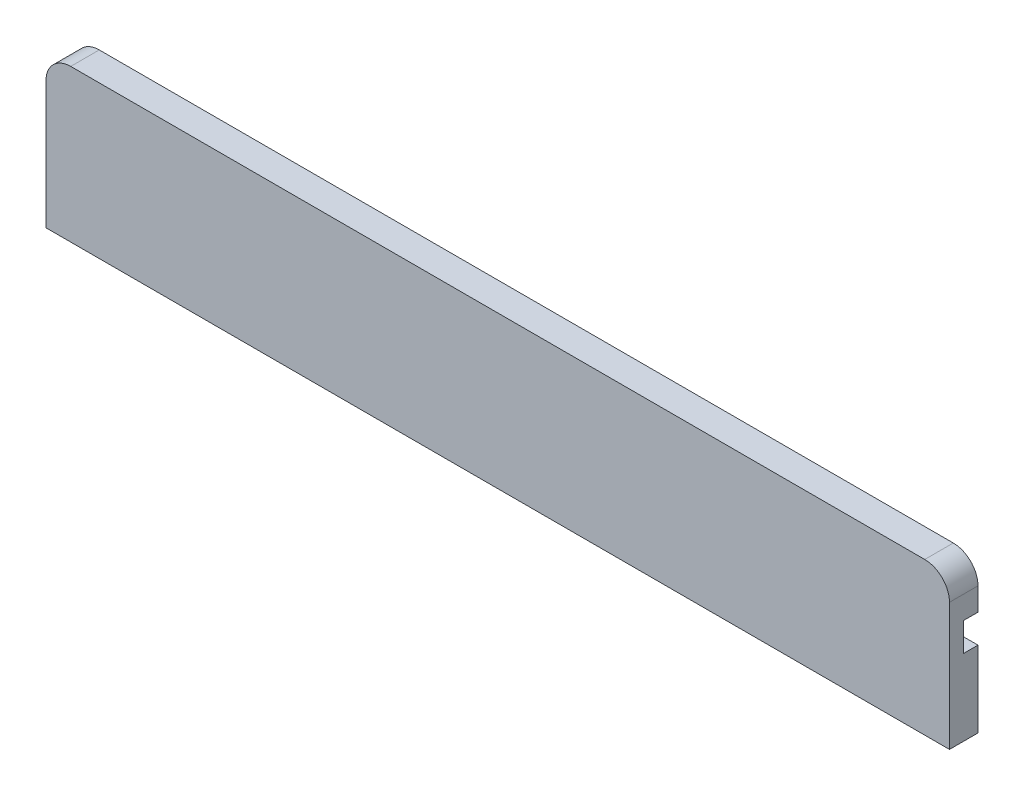
ISO-10303-21;
HEADER;
FILE_DESCRIPTION(('STEP AP214'),'2;1');
FILE_NAME('part.step','',(''),(''),'','','');
FILE_SCHEMA(('AUTOMOTIVE_DESIGN { 1 0 10303 214 1 1 1 1 }'));
ENDSEC;
DATA;
#1=APPLICATION_CONTEXT('core data for automotive mechanical design processes');
#2=APPLICATION_PROTOCOL_DEFINITION('international standard','automotive_design',2000,#1);
#3=PRODUCT_CONTEXT('',#1,'mechanical');
#4=PRODUCT('Part','Part','',(#3));
#5=PRODUCT_RELATED_PRODUCT_CATEGORY('part','',(#4));
#6=PRODUCT_DEFINITION_FORMATION('','',#4);
#7=PRODUCT_DEFINITION_CONTEXT('part definition',#1,'design');
#8=PRODUCT_DEFINITION('design','',#6,#7);
#9=PRODUCT_DEFINITION_SHAPE('','',#8);
#10=(LENGTH_UNIT() NAMED_UNIT(*) SI_UNIT(.MILLI.,.METRE.));
#11=(NAMED_UNIT(*) PLANE_ANGLE_UNIT() SI_UNIT($,.RADIAN.));
#12=(NAMED_UNIT(*) SI_UNIT($,.STERADIAN.) SOLID_ANGLE_UNIT());
#13=UNCERTAINTY_MEASURE_WITH_UNIT(LENGTH_MEASURE(1.E-05),#10,'distance_accuracy_value','');
#14=(GEOMETRIC_REPRESENTATION_CONTEXT(3) GLOBAL_UNCERTAINTY_ASSIGNED_CONTEXT((#13)) GLOBAL_UNIT_ASSIGNED_CONTEXT((#10,
#11,#12)) REPRESENTATION_CONTEXT('',''));
#15=CARTESIAN_POINT('',(0.,0.,0.));
#16=DIRECTION('',(0.,0.,1.));
#17=DIRECTION('',(1.,0.,0.));
#18=AXIS2_PLACEMENT_3D('',#15,#16,#17);
#19=CARTESIAN_POINT('',(0.,0.,0.));
#20=DIRECTION('',(0.,0.,1.));
#21=DIRECTION('',(1.,0.,0.));
#22=AXIS2_PLACEMENT_3D('',#19,#20,#21);
#23=PLANE('',#22);
#24=DIRECTION('',(0.,-1.,0.));
#25=VECTOR('',#24,1.);
#26=CARTESIAN_POINT('',(-301.625,101.6,0.));
#27=LINE('',#26,#25);
#28=CARTESIAN_POINT('',(-301.625,50.8,0.));
#29=VERTEX_POINT('',#28);
#30=CARTESIAN_POINT('',(-301.625,0.,0.));
#31=VERTEX_POINT('',#30);
#32=EDGE_CURVE('E170',#29,#31,#27,.T.);
#33=ORIENTED_EDGE('',*,*,#32,.F.);
#34=DIRECTION('',(1.,0.,0.));
#35=VECTOR('',#34,1.);
#36=CARTESIAN_POINT('',(-301.625,50.8,0.));
#37=LINE('',#36,#35);
#38=CARTESIAN_POINT('',(301.625,50.8,0.));
#39=VERTEX_POINT('',#38);
#40=EDGE_CURVE('E149',#29,#39,#37,.T.);
#41=ORIENTED_EDGE('',*,*,#40,.T.);
#42=DIRECTION('',(0.,1.,0.));
#43=VECTOR('',#42,1.);
#44=CARTESIAN_POINT('',(301.625,101.6,0.));
#45=LINE('',#44,#43);
#46=CARTESIAN_POINT('',(301.625,0.,0.));
#47=VERTEX_POINT('',#46);
#48=EDGE_CURVE('E159',#47,#39,#45,.T.);
#49=ORIENTED_EDGE('',*,*,#48,.F.);
#50=DIRECTION('',(1.,0.,0.));
#51=VECTOR('',#50,1.);
#52=CARTESIAN_POINT('',(301.625,0.,0.));
#53=LINE('',#52,#51);
#54=EDGE_CURVE('E172',#31,#47,#53,.T.);
#55=ORIENTED_EDGE('',*,*,#54,.F.);
#56=EDGE_LOOP('',(#33,#41,#49,#55));
#57=FACE_BOUND('',#56,.T.);
#58=ADVANCED_FACE('F34',(#57),#23,.F.);
#59=CARTESIAN_POINT('',(301.625,101.6,19.05));
#60=DIRECTION('',(0.,-1.,0.));
#61=DIRECTION('',(1.,0.,0.));
#62=AXIS2_PLACEMENT_3D('',#59,#60,#61);
#63=PLANE('',#62);
#64=DIRECTION('',(-1.,0.,0.));
#65=VECTOR('',#64,1.);
#66=CARTESIAN_POINT('',(301.625,101.6,0.));
#67=LINE('',#66,#65);
#68=CARTESIAN_POINT('',(285.115,101.6,0.));
#69=VERTEX_POINT('',#68);
#70=CARTESIAN_POINT('',(-285.115,101.6,0.));
#71=VERTEX_POINT('',#70);
#72=EDGE_CURVE('E152',#69,#71,#67,.T.);
#73=ORIENTED_EDGE('',*,*,#72,.T.);
#74=DIRECTION('',(0.,0.,-1.));
#75=VECTOR('',#74,1.);
#76=CARTESIAN_POINT('',(-285.115,101.6,19.05));
#77=LINE('',#76,#75);
#78=CARTESIAN_POINT('',(-285.115,101.6,19.05));
#79=VERTEX_POINT('',#78);
#80=EDGE_CURVE('E55',#71,#79,#77,.F.);
#81=ORIENTED_EDGE('',*,*,#80,.T.);
#82=DIRECTION('',(-1.,0.,0.));
#83=VECTOR('',#82,1.);
#84=CARTESIAN_POINT('',(301.625,101.6,19.05));
#85=LINE('',#84,#83);
#86=CARTESIAN_POINT('',(285.115,101.6,19.05));
#87=VERTEX_POINT('',#86);
#88=EDGE_CURVE('E155',#87,#79,#85,.T.);
#89=ORIENTED_EDGE('',*,*,#88,.F.);
#90=DIRECTION('',(0.,0.,-1.));
#91=VECTOR('',#90,1.);
#92=CARTESIAN_POINT('',(285.115,101.6,19.05));
#93=LINE('',#92,#91);
#94=EDGE_CURVE('E190',#87,#69,#93,.T.);
#95=ORIENTED_EDGE('',*,*,#94,.T.);
#96=EDGE_LOOP('',(#73,#81,#89,#95));
#97=FACE_BOUND('',#96,.T.);
#98=ADVANCED_FACE('F207',(#97),#63,.F.);
#99=CARTESIAN_POINT('',(-301.625,101.6,19.05));
#100=DIRECTION('',(1.,0.,0.));
#101=DIRECTION('',(0.,0.,-1.));
#102=AXIS2_PLACEMENT_3D('',#99,#100,#101);
#103=PLANE('',#102);
#104=DIRECTION('',(0.,-1.,0.));
#105=VECTOR('',#104,1.);
#106=CARTESIAN_POINT('',(-301.625,101.6,19.05));
#107=LINE('',#106,#105);
#108=CARTESIAN_POINT('',(-301.625,85.09,19.05));
#109=VERTEX_POINT('',#108);
#110=CARTESIAN_POINT('',(-301.625,0.,19.05));
#111=VERTEX_POINT('',#110);
#112=EDGE_CURVE('E158',#109,#111,#107,.T.);
#113=ORIENTED_EDGE('',*,*,#112,.F.);
#114=DIRECTION('',(0.,0.,-1.));
#115=VECTOR('',#114,1.);
#116=CARTESIAN_POINT('',(-301.625,85.09,19.05));
#117=LINE('',#116,#115);
#118=CARTESIAN_POINT('',(-301.625,85.09,0.));
#119=VERTEX_POINT('',#118);
#120=EDGE_CURVE('E184',#109,#119,#117,.T.);
#121=ORIENTED_EDGE('',*,*,#120,.T.);
#122=CARTESIAN_POINT('',(-301.625,69.85,0.));
#123=VERTEX_POINT('',#122);
#124=EDGE_CURVE('E140',#119,#123,#27,.T.);
#125=ORIENTED_EDGE('',*,*,#124,.T.);
#126=DIRECTION('',(0.,0.,1.));
#127=VECTOR('',#126,1.);
#128=CARTESIAN_POINT('',(-301.625,69.85,0.));
#129=LINE('',#128,#127);
#130=CARTESIAN_POINT('',(-301.625,69.85,9.525));
#131=VERTEX_POINT('',#130);
#132=EDGE_CURVE('E117',#123,#131,#129,.T.);
#133=ORIENTED_EDGE('',*,*,#132,.T.);
#134=DIRECTION('',(0.,-1.,0.));
#135=VECTOR('',#134,1.);
#136=CARTESIAN_POINT('',(-301.625,69.85,9.525));
#137=LINE('',#136,#135);
#138=CARTESIAN_POINT('',(-301.625,50.8,9.525));
#139=VERTEX_POINT('',#138);
#140=EDGE_CURVE('E128',#131,#139,#137,.T.);
#141=ORIENTED_EDGE('',*,*,#140,.T.);
#142=DIRECTION('',(0.,0.,-1.));
#143=VECTOR('',#142,1.);
#144=CARTESIAN_POINT('',(-301.625,50.8,0.));
#145=LINE('',#144,#143);
#146=EDGE_CURVE('E134',#139,#29,#145,.T.);
#147=ORIENTED_EDGE('',*,*,#146,.T.);
#148=ORIENTED_EDGE('',*,*,#32,.T.);
#149=DIRECTION('',(0.,0.,-1.));
#150=VECTOR('',#149,1.);
#151=CARTESIAN_POINT('',(-301.625,0.,19.05));
#152=LINE('',#151,#150);
#153=EDGE_CURVE('E180',#111,#31,#152,.T.);
#154=ORIENTED_EDGE('',*,*,#153,.F.);
#155=EDGE_LOOP('',(#113,#121,#125,#133,#141,#147,#148,#154));
#156=FACE_BOUND('',#155,.T.);
#157=ADVANCED_FACE('F137',(#156),#103,.F.);
#158=CARTESIAN_POINT('',(301.625,0.,19.05));
#159=DIRECTION('',(0.,1.,0.));
#160=DIRECTION('',(-1.,0.,0.));
#161=AXIS2_PLACEMENT_3D('',#158,#159,#160);
#162=PLANE('',#161);
#163=ORIENTED_EDGE('',*,*,#54,.T.);
#164=DIRECTION('',(0.,0.,-1.));
#165=VECTOR('',#164,1.);
#166=CARTESIAN_POINT('',(301.625,0.,19.05));
#167=LINE('',#166,#165);
#168=CARTESIAN_POINT('',(301.625,0.,19.05));
#169=VERTEX_POINT('',#168);
#170=EDGE_CURVE('E167',#169,#47,#167,.T.);
#171=ORIENTED_EDGE('',*,*,#170,.F.);
#172=DIRECTION('',(1.,0.,0.));
#173=VECTOR('',#172,1.);
#174=CARTESIAN_POINT('',(301.625,0.,19.05));
#175=LINE('',#174,#173);
#176=EDGE_CURVE('E162',#111,#169,#175,.T.);
#177=ORIENTED_EDGE('',*,*,#176,.F.);
#178=ORIENTED_EDGE('',*,*,#153,.T.);
#179=EDGE_LOOP('',(#163,#171,#177,#178));
#180=FACE_BOUND('',#179,.T.);
#181=ADVANCED_FACE('F221',(#180),#162,.F.);
#182=CARTESIAN_POINT('',(301.625,101.6,19.05));
#183=DIRECTION('',(-1.,0.,0.));
#184=DIRECTION('',(0.,0.,1.));
#185=AXIS2_PLACEMENT_3D('',#182,#183,#184);
#186=PLANE('',#185);
#187=CARTESIAN_POINT('',(301.625,69.85,0.));
#188=VERTEX_POINT('',#187);
#189=CARTESIAN_POINT('',(301.625,85.0899999999999,0.));
#190=VERTEX_POINT('',#189);
#191=EDGE_CURVE('E175',#188,#190,#45,.T.);
#192=ORIENTED_EDGE('',*,*,#191,.T.);
#193=DIRECTION('',(0.,0.,-1.));
#194=VECTOR('',#193,1.);
#195=CARTESIAN_POINT('',(301.625,85.0899999999999,19.05));
#196=LINE('',#195,#194);
#197=CARTESIAN_POINT('',(301.625,85.0899999999999,19.05));
#198=VERTEX_POINT('',#197);
#199=EDGE_CURVE('E11',#190,#198,#196,.F.);
#200=ORIENTED_EDGE('',*,*,#199,.T.);
#201=DIRECTION('',(0.,1.,0.));
#202=VECTOR('',#201,1.);
#203=CARTESIAN_POINT('',(301.625,101.6,19.05));
#204=LINE('',#203,#202);
#205=EDGE_CURVE('E165',#169,#198,#204,.T.);
#206=ORIENTED_EDGE('',*,*,#205,.F.);
#207=ORIENTED_EDGE('',*,*,#170,.T.);
#208=ORIENTED_EDGE('',*,*,#48,.T.);
#209=DIRECTION('',(0.,0.,-1.));
#210=VECTOR('',#209,1.);
#211=CARTESIAN_POINT('',(301.625,50.8,0.));
#212=LINE('',#211,#210);
#213=CARTESIAN_POINT('',(301.625,50.8,9.525));
#214=VERTEX_POINT('',#213);
#215=EDGE_CURVE('E141',#214,#39,#212,.T.);
#216=ORIENTED_EDGE('',*,*,#215,.F.);
#217=DIRECTION('',(0.,-1.,0.));
#218=VECTOR('',#217,1.);
#219=CARTESIAN_POINT('',(301.625,69.85,9.525));
#220=LINE('',#219,#218);
#221=CARTESIAN_POINT('',(301.625,69.85,9.525));
#222=VERTEX_POINT('',#221);
#223=EDGE_CURVE('E143',#222,#214,#220,.T.);
#224=ORIENTED_EDGE('',*,*,#223,.F.);
#225=DIRECTION('',(0.,0.,1.));
#226=VECTOR('',#225,1.);
#227=CARTESIAN_POINT('',(301.625,69.85,0.));
#228=LINE('',#227,#226);
#229=EDGE_CURVE('E120',#188,#222,#228,.T.);
#230=ORIENTED_EDGE('',*,*,#229,.F.);
#231=EDGE_LOOP('',(#192,#200,#206,#207,#208,#216,#224,#230));
#232=FACE_BOUND('',#231,.T.);
#233=ADVANCED_FACE('F212',(#232),#186,.F.);
#234=CARTESIAN_POINT('',(0.,0.,19.05));
#235=DIRECTION('',(0.,0.,1.));
#236=DIRECTION('',(1.,0.,0.));
#237=AXIS2_PLACEMENT_3D('',#234,#235,#236);
#238=PLANE('',#237);
#239=ORIENTED_EDGE('',*,*,#88,.T.);
#240=CARTESIAN_POINT('',(-285.115,85.09,19.05));
#241=DIRECTION('',(0.,0.,1.));
#242=DIRECTION('',(1.,0.,0.));
#243=AXIS2_PLACEMENT_3D('',#240,#241,#242);
#244=CIRCLE('',#243,16.51);
#245=EDGE_CURVE('E42',#79,#109,#244,.T.);
#246=ORIENTED_EDGE('',*,*,#245,.T.);
#247=ORIENTED_EDGE('',*,*,#112,.T.);
#248=ORIENTED_EDGE('',*,*,#176,.T.);
#249=ORIENTED_EDGE('',*,*,#205,.T.);
#250=CARTESIAN_POINT('',(285.115,85.0899999999999,19.05));
#251=DIRECTION('',(0.,0.,1.));
#252=DIRECTION('',(1.,0.,0.));
#253=AXIS2_PLACEMENT_3D('',#250,#251,#252);
#254=CIRCLE('',#253,16.51);
#255=EDGE_CURVE('E194',#198,#87,#254,.T.);
#256=ORIENTED_EDGE('',*,*,#255,.T.);
#257=EDGE_LOOP('',(#239,#246,#247,#248,#249,#256));
#258=FACE_BOUND('',#257,.T.);
#259=ADVANCED_FACE('F198',(#258),#238,.T.);
#260=ORIENTED_EDGE('',*,*,#124,.F.);
#261=CARTESIAN_POINT('',(-285.115,85.09,0.));
#262=DIRECTION('',(0.,0.,1.));
#263=DIRECTION('',(1.,0.,0.));
#264=AXIS2_PLACEMENT_3D('',#261,#262,#263);
#265=CIRCLE('',#264,16.51);
#266=EDGE_CURVE('E188',#119,#71,#265,.F.);
#267=ORIENTED_EDGE('',*,*,#266,.T.);
#268=ORIENTED_EDGE('',*,*,#72,.F.);
#269=CARTESIAN_POINT('',(285.115,85.0899999999999,0.));
#270=DIRECTION('',(0.,0.,1.));
#271=DIRECTION('',(1.,0.,0.));
#272=AXIS2_PLACEMENT_3D('',#269,#270,#271);
#273=CIRCLE('',#272,16.51);
#274=EDGE_CURVE('E186',#69,#190,#273,.F.);
#275=ORIENTED_EDGE('',*,*,#274,.T.);
#276=ORIENTED_EDGE('',*,*,#191,.F.);
#277=DIRECTION('',(1.,0.,0.));
#278=VECTOR('',#277,1.);
#279=CARTESIAN_POINT('',(-301.625,69.85,0.));
#280=LINE('',#279,#278);
#281=EDGE_CURVE('E125',#123,#188,#280,.T.);
#282=ORIENTED_EDGE('',*,*,#281,.F.);
#283=EDGE_LOOP('',(#260,#267,#268,#275,#276,#282));
#284=FACE_BOUND('',#283,.T.);
#285=ADVANCED_FACE('F206',(#284),#23,.F.);
#286=CARTESIAN_POINT('',(-301.625,50.8,0.));
#287=DIRECTION('',(0.,-1.,0.));
#288=DIRECTION('',(0.,0.,-1.));
#289=AXIS2_PLACEMENT_3D('',#286,#287,#288);
#290=PLANE('',#289);
#291=ORIENTED_EDGE('',*,*,#215,.T.);
#292=ORIENTED_EDGE('',*,*,#40,.F.);
#293=ORIENTED_EDGE('',*,*,#146,.F.);
#294=DIRECTION('',(1.,0.,0.));
#295=VECTOR('',#294,1.);
#296=CARTESIAN_POINT('',(-301.625,50.8,9.525));
#297=LINE('',#296,#295);
#298=EDGE_CURVE('E124',#139,#214,#297,.T.);
#299=ORIENTED_EDGE('',*,*,#298,.T.);
#300=EDGE_LOOP('',(#291,#292,#293,#299));
#301=FACE_BOUND('',#300,.T.);
#302=ADVANCED_FACE('F216',(#301),#290,.F.);
#303=CARTESIAN_POINT('',(-301.625,69.85,9.525));
#304=DIRECTION('',(0.,0.,1.));
#305=DIRECTION('',(0.,-1.,0.));
#306=AXIS2_PLACEMENT_3D('',#303,#304,#305);
#307=PLANE('',#306);
#308=ORIENTED_EDGE('',*,*,#223,.T.);
#309=ORIENTED_EDGE('',*,*,#298,.F.);
#310=ORIENTED_EDGE('',*,*,#140,.F.);
#311=DIRECTION('',(1.,0.,0.));
#312=VECTOR('',#311,1.);
#313=CARTESIAN_POINT('',(-301.625,69.85,9.525));
#314=LINE('',#313,#312);
#315=EDGE_CURVE('E113',#131,#222,#314,.T.);
#316=ORIENTED_EDGE('',*,*,#315,.T.);
#317=EDGE_LOOP('',(#308,#309,#310,#316));
#318=FACE_BOUND('',#317,.T.);
#319=ADVANCED_FACE('F129',(#318),#307,.F.);
#320=CARTESIAN_POINT('',(-301.625,69.85,0.));
#321=DIRECTION('',(0.,1.,0.));
#322=DIRECTION('',(0.,0.,1.));
#323=AXIS2_PLACEMENT_3D('',#320,#321,#322);
#324=PLANE('',#323);
#325=ORIENTED_EDGE('',*,*,#229,.T.);
#326=ORIENTED_EDGE('',*,*,#315,.F.);
#327=ORIENTED_EDGE('',*,*,#132,.F.);
#328=ORIENTED_EDGE('',*,*,#281,.T.);
#329=EDGE_LOOP('',(#325,#326,#327,#328));
#330=FACE_BOUND('',#329,.T.);
#331=ADVANCED_FACE('F115',(#330),#324,.F.);
#332=CARTESIAN_POINT('',(-285.115,85.09,19.05));
#333=DIRECTION('',(0.,0.,-1.));
#334=DIRECTION('',(-1.,0.,0.));
#335=AXIS2_PLACEMENT_3D('',#332,#333,#334);
#336=CYLINDRICAL_SURFACE('',#335,16.51);
#337=ORIENTED_EDGE('',*,*,#245,.F.);
#338=ORIENTED_EDGE('',*,*,#80,.F.);
#339=ORIENTED_EDGE('',*,*,#266,.F.);
#340=ORIENTED_EDGE('',*,*,#120,.F.);
#341=EDGE_LOOP('',(#337,#338,#339,#340));
#342=FACE_BOUND('',#341,.T.);
#343=ADVANCED_FACE('F203',(#342),#336,.T.);
#344=CARTESIAN_POINT('',(285.115,85.0899999999999,19.05));
#345=DIRECTION('',(0.,0.,-1.));
#346=DIRECTION('',(-1.,0.,0.));
#347=AXIS2_PLACEMENT_3D('',#344,#345,#346);
#348=CYLINDRICAL_SURFACE('',#347,16.51);
#349=ORIENTED_EDGE('',*,*,#255,.F.);
#350=ORIENTED_EDGE('',*,*,#199,.F.);
#351=ORIENTED_EDGE('',*,*,#274,.F.);
#352=ORIENTED_EDGE('',*,*,#94,.F.);
#353=EDGE_LOOP('',(#349,#350,#351,#352));
#354=FACE_BOUND('',#353,.T.);
#355=ADVANCED_FACE('F36',(#354),#348,.T.);
#356=CLOSED_SHELL('',(#58,#98,#157,#181,#233,#259,#285,#302,#319,#331,#343,#355));
#357=MANIFOLD_SOLID_BREP('B2',#356);
#358=ADVANCED_BREP_SHAPE_REPRESENTATION('',(#18,#357),#14);
#359=SHAPE_DEFINITION_REPRESENTATION(#9,#358);
ENDSEC;
END-ISO-10303-21;
